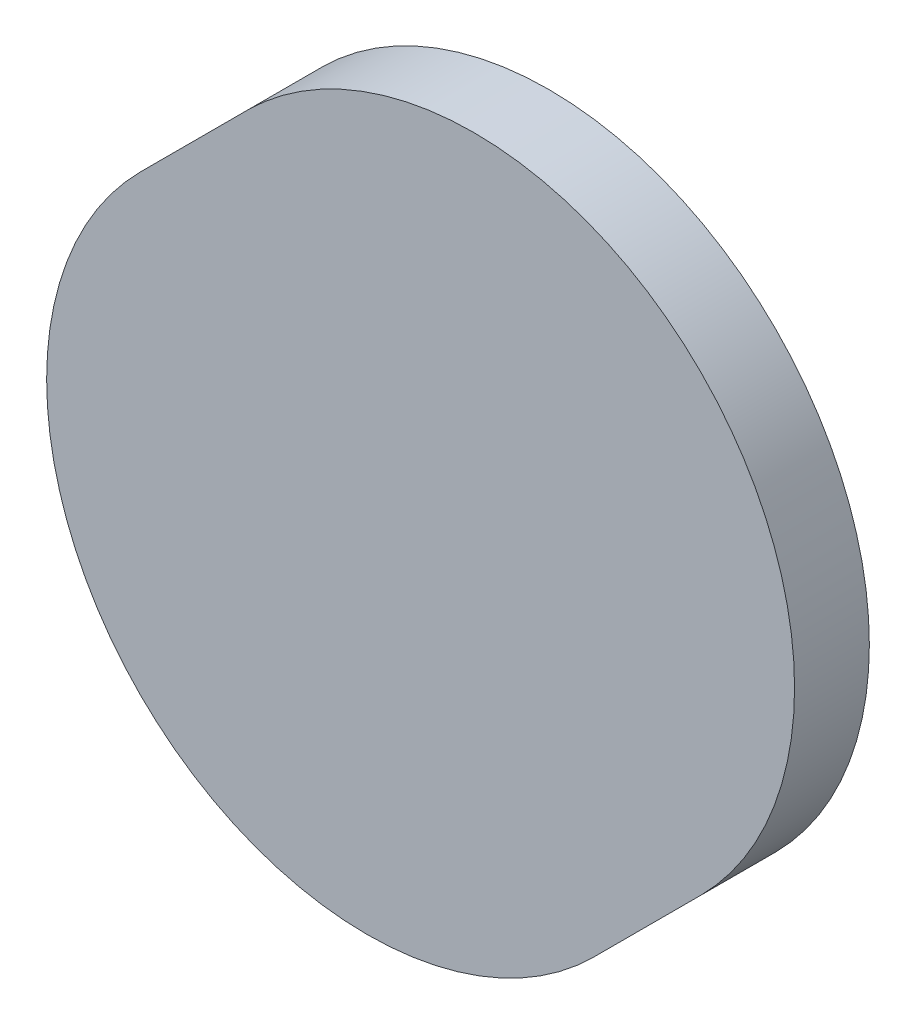
ISO-10303-21;
HEADER;
FILE_DESCRIPTION(('STEP AP214'),'2;1');
FILE_NAME('part.step','',(''),(''),'','','');
FILE_SCHEMA(('AUTOMOTIVE_DESIGN { 1 0 10303 214 1 1 1 1 }'));
ENDSEC;
DATA;
#1=APPLICATION_CONTEXT('core data for automotive mechanical design processes');
#2=APPLICATION_PROTOCOL_DEFINITION('international standard','automotive_design',2000,#1);
#3=PRODUCT_CONTEXT('',#1,'mechanical');
#4=PRODUCT('Part','Part','',(#3));
#5=PRODUCT_RELATED_PRODUCT_CATEGORY('part','',(#4));
#6=PRODUCT_DEFINITION_FORMATION('','',#4);
#7=PRODUCT_DEFINITION_CONTEXT('part definition',#1,'design');
#8=PRODUCT_DEFINITION('design','',#6,#7);
#9=PRODUCT_DEFINITION_SHAPE('','',#8);
#10=(LENGTH_UNIT() NAMED_UNIT(*) SI_UNIT(.MILLI.,.METRE.));
#11=(NAMED_UNIT(*) PLANE_ANGLE_UNIT() SI_UNIT($,.RADIAN.));
#12=(NAMED_UNIT(*) SI_UNIT($,.STERADIAN.) SOLID_ANGLE_UNIT());
#13=UNCERTAINTY_MEASURE_WITH_UNIT(LENGTH_MEASURE(1.E-05),#10,'distance_accuracy_value','');
#14=(GEOMETRIC_REPRESENTATION_CONTEXT(3) GLOBAL_UNCERTAINTY_ASSIGNED_CONTEXT((#13)) GLOBAL_UNIT_ASSIGNED_CONTEXT((#10,
#11,#12)) REPRESENTATION_CONTEXT('',''));
#15=CARTESIAN_POINT('',(0.,0.,0.));
#16=DIRECTION('',(0.,0.,1.));
#17=DIRECTION('',(1.,0.,0.));
#18=AXIS2_PLACEMENT_3D('',#15,#16,#17);
#19=CARTESIAN_POINT('',(135.852066,-105.240066,1.635));
#20=DIRECTION('',(0.,0.,1.));
#21=DIRECTION('',(1.,0.,0.));
#22=AXIS2_PLACEMENT_3D('',#19,#20,#21);
#23=PLANE('',#22);
#24=DIRECTION('',(0.707106781186048,0.707106781187048,0.));
#25=VECTOR('',#24,1.);
#26=CARTESIAN_POINT('',(135.852066,-105.240066,1.635));
#27=LINE('',#26,#25);
#28=CARTESIAN_POINT('',(135.852066,-105.240066,1.635));
#29=VERTEX_POINT('',#28);
#30=CARTESIAN_POINT('',(135.902066,-105.190066,1.635));
#31=VERTEX_POINT('',#30);
#32=EDGE_CURVE('E98',#29,#31,#27,.T.);
#33=ORIENTED_EDGE('',*,*,#32,.T.);
#34=CARTESIAN_POINT('',(135.7959995,-105.0839995,1.635));
#35=DIRECTION('',(0.,0.,1.));
#36=DIRECTION('',(0.707106781186548,-0.707106781186548,0.));
#37=AXIS2_PLACEMENT_3D('',#34,#35,#36);
#38=CIRCLE('',#37,0.150000682813);
#39=CARTESIAN_POINT('',(135.689933,-104.977933,1.635));
#40=VERTEX_POINT('',#39);
#41=EDGE_CURVE('E77',#31,#40,#38,.T.);
#42=ORIENTED_EDGE('',*,*,#41,.T.);
#43=DIRECTION('',(-0.707106781186048,-0.707106781187048,0.));
#44=VECTOR('',#43,1.);
#45=CARTESIAN_POINT('',(135.689933,-104.977933,1.635));
#46=LINE('',#45,#44);
#47=CARTESIAN_POINT('',(135.639933,-105.027933,1.635));
#48=VERTEX_POINT('',#47);
#49=EDGE_CURVE('E82',#40,#48,#46,.T.);
#50=ORIENTED_EDGE('',*,*,#49,.T.);
#51=CARTESIAN_POINT('',(135.7459995,-105.1339995,1.635));
#52=DIRECTION('',(0.,0.,1.));
#53=DIRECTION('',(-0.707106781186548,0.707106781186548,0.));
#54=AXIS2_PLACEMENT_3D('',#51,#52,#53);
#55=CIRCLE('',#54,0.150000682813);
#56=EDGE_CURVE('E11',#48,#29,#55,.T.);
#57=ORIENTED_EDGE('',*,*,#56,.T.);
#58=EDGE_LOOP('',(#33,#42,#50,#57));
#59=FACE_BOUND('',#58,.T.);
#60=ADVANCED_FACE('F17',(#59),#23,.T.);
#61=CARTESIAN_POINT('',(135.852066,-105.240066,1.6));
#62=DIRECTION('',(0.,0.,1.));
#63=DIRECTION('',(1.,0.,0.));
#64=AXIS2_PLACEMENT_3D('',#61,#62,#63);
#65=PLANE('',#64);
#66=CARTESIAN_POINT('',(135.7459995,-105.1339995,1.6));
#67=DIRECTION('',(0.,0.,1.));
#68=DIRECTION('',(-0.707106781186548,0.707106781186548,0.));
#69=AXIS2_PLACEMENT_3D('',#66,#67,#68);
#70=CIRCLE('',#69,0.150000682813);
#71=CARTESIAN_POINT('',(135.639933,-105.027933,1.6));
#72=VERTEX_POINT('',#71);
#73=CARTESIAN_POINT('',(135.852066,-105.240066,1.6));
#74=VERTEX_POINT('',#73);
#75=EDGE_CURVE('E26',#72,#74,#70,.T.);
#76=ORIENTED_EDGE('',*,*,#75,.F.);
#77=DIRECTION('',(-0.707106781186048,-0.707106781187048,0.));
#78=VECTOR('',#77,1.);
#79=CARTESIAN_POINT('',(135.689933,-104.977933,1.6));
#80=LINE('',#79,#78);
#81=CARTESIAN_POINT('',(135.689933,-104.977933,1.6));
#82=VERTEX_POINT('',#81);
#83=EDGE_CURVE('E68',#82,#72,#80,.T.);
#84=ORIENTED_EDGE('',*,*,#83,.F.);
#85=CARTESIAN_POINT('',(135.7959995,-105.0839995,1.6));
#86=DIRECTION('',(0.,0.,1.));
#87=DIRECTION('',(0.707106781186548,-0.707106781186548,0.));
#88=AXIS2_PLACEMENT_3D('',#85,#86,#87);
#89=CIRCLE('',#88,0.150000682813);
#90=CARTESIAN_POINT('',(135.902066,-105.190066,1.6));
#91=VERTEX_POINT('',#90);
#92=EDGE_CURVE('E71',#91,#82,#89,.T.);
#93=ORIENTED_EDGE('',*,*,#92,.F.);
#94=DIRECTION('',(0.707106781186048,0.707106781187048,0.));
#95=VECTOR('',#94,1.);
#96=CARTESIAN_POINT('',(135.852066,-105.240066,1.6));
#97=LINE('',#96,#95);
#98=EDGE_CURVE('E116',#74,#91,#97,.T.);
#99=ORIENTED_EDGE('',*,*,#98,.F.);
#100=EDGE_LOOP('',(#76,#84,#93,#99));
#101=FACE_BOUND('',#100,.T.);
#102=ADVANCED_FACE('F19',(#101),#65,.F.);
#103=CARTESIAN_POINT('',(135.7459995,-105.1339995,1.6));
#104=DIRECTION('',(0.,0.,-1.));
#105=DIRECTION('',(-0.707106781186548,0.707106781186548,0.));
#106=AXIS2_PLACEMENT_3D('',#103,#104,#105);
#107=CYLINDRICAL_SURFACE('',#106,0.150000682813);
#108=ORIENTED_EDGE('',*,*,#75,.T.);
#109=DIRECTION('',(0.,0.,1.));
#110=VECTOR('',#109,1.);
#111=CARTESIAN_POINT('',(135.852066,-105.240066,1.6));
#112=LINE('',#111,#110);
#113=EDGE_CURVE('E92',#74,#29,#112,.T.);
#114=ORIENTED_EDGE('',*,*,#113,.T.);
#115=ORIENTED_EDGE('',*,*,#56,.F.);
#116=DIRECTION('',(0.,0.,1.));
#117=VECTOR('',#116,1.);
#118=CARTESIAN_POINT('',(135.639933,-105.027933,1.6));
#119=LINE('',#118,#117);
#120=EDGE_CURVE('E76',#72,#48,#119,.T.);
#121=ORIENTED_EDGE('',*,*,#120,.F.);
#122=EDGE_LOOP('',(#108,#114,#115,#121));
#123=FACE_BOUND('',#122,.T.);
#124=ADVANCED_FACE('F126',(#123),#107,.T.);
#125=CARTESIAN_POINT('',(135.689933,-104.977933,1.6));
#126=DIRECTION('',(0.707106781187048,-0.707106781186048,0.));
#127=DIRECTION('',(0.,0.,-1.));
#128=AXIS2_PLACEMENT_3D('',#125,#126,#127);
#129=PLANE('',#128);
#130=ORIENTED_EDGE('',*,*,#83,.T.);
#131=ORIENTED_EDGE('',*,*,#120,.T.);
#132=ORIENTED_EDGE('',*,*,#49,.F.);
#133=DIRECTION('',(0.,0.,1.));
#134=VECTOR('',#133,1.);
#135=CARTESIAN_POINT('',(135.689933,-104.977933,1.6));
#136=LINE('',#135,#134);
#137=EDGE_CURVE('E80',#82,#40,#136,.T.);
#138=ORIENTED_EDGE('',*,*,#137,.F.);
#139=EDGE_LOOP('',(#130,#131,#132,#138));
#140=FACE_BOUND('',#139,.T.);
#141=ADVANCED_FACE('F81',(#140),#129,.F.);
#142=CARTESIAN_POINT('',(135.7959995,-105.0839995,1.6));
#143=DIRECTION('',(0.,0.,-1.));
#144=DIRECTION('',(0.707106781186548,-0.707106781186548,0.));
#145=AXIS2_PLACEMENT_3D('',#142,#143,#144);
#146=CYLINDRICAL_SURFACE('',#145,0.150000682813);
#147=ORIENTED_EDGE('',*,*,#92,.T.);
#148=ORIENTED_EDGE('',*,*,#137,.T.);
#149=ORIENTED_EDGE('',*,*,#41,.F.);
#150=DIRECTION('',(0.,0.,1.));
#151=VECTOR('',#150,1.);
#152=CARTESIAN_POINT('',(135.902066,-105.190066,1.6));
#153=LINE('',#152,#151);
#154=EDGE_CURVE('E89',#91,#31,#153,.T.);
#155=ORIENTED_EDGE('',*,*,#154,.F.);
#156=EDGE_LOOP('',(#147,#148,#149,#155));
#157=FACE_BOUND('',#156,.T.);
#158=ADVANCED_FACE('F87',(#157),#146,.T.);
#159=CARTESIAN_POINT('',(135.852066,-105.240066,1.6));
#160=DIRECTION('',(-0.707106781187048,0.707106781186048,0.));
#161=DIRECTION('',(0.,0.,1.));
#162=AXIS2_PLACEMENT_3D('',#159,#160,#161);
#163=PLANE('',#162);
#164=ORIENTED_EDGE('',*,*,#98,.T.);
#165=ORIENTED_EDGE('',*,*,#154,.T.);
#166=ORIENTED_EDGE('',*,*,#32,.F.);
#167=ORIENTED_EDGE('',*,*,#113,.F.);
#168=EDGE_LOOP('',(#164,#165,#166,#167));
#169=FACE_BOUND('',#168,.T.);
#170=ADVANCED_FACE('F124',(#169),#163,.F.);
#171=CLOSED_SHELL('',(#60,#102,#124,#141,#158,#170));
#172=MANIFOLD_SOLID_BREP('B1',#171);
#173=ADVANCED_BREP_SHAPE_REPRESENTATION('',(#18,#172),#14);
#174=SHAPE_DEFINITION_REPRESENTATION(#9,#173);
ENDSEC;
END-ISO-10303-21;
